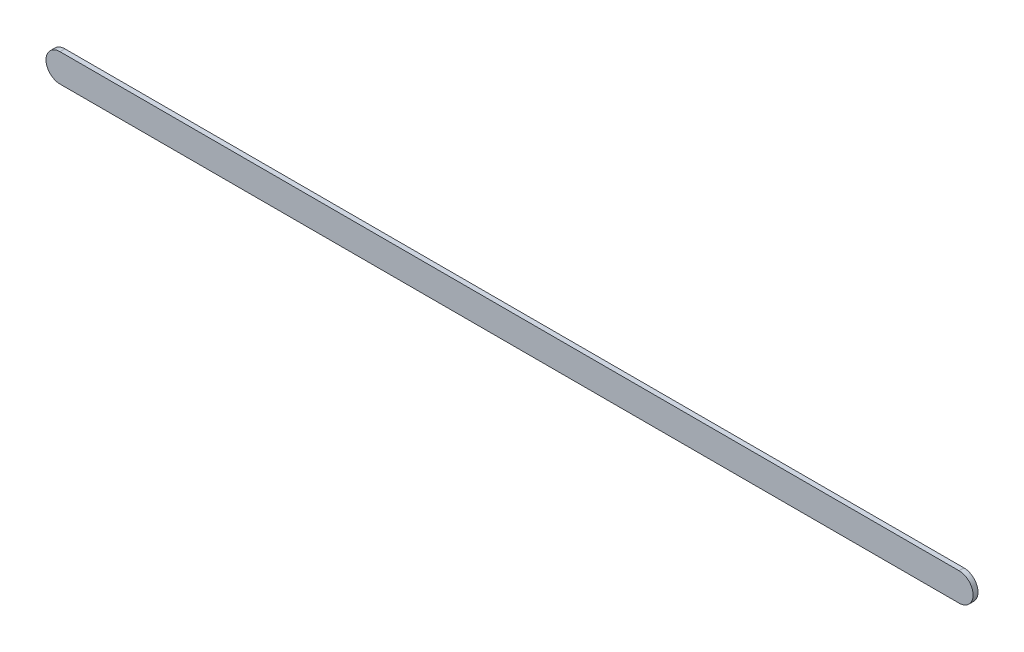
ISO-10303-21;
HEADER;
FILE_DESCRIPTION(('STEP AP214'),'2;1');
FILE_NAME('part.step','',(''),(''),'','','');
FILE_SCHEMA(('AUTOMOTIVE_DESIGN { 1 0 10303 214 1 1 1 1 }'));
ENDSEC;
DATA;
#1=APPLICATION_CONTEXT('core data for automotive mechanical design processes');
#2=APPLICATION_PROTOCOL_DEFINITION('international standard','automotive_design',2000,#1);
#3=PRODUCT_CONTEXT('',#1,'mechanical');
#4=PRODUCT('Part','Part','',(#3));
#5=PRODUCT_RELATED_PRODUCT_CATEGORY('part','',(#4));
#6=PRODUCT_DEFINITION_FORMATION('','',#4);
#7=PRODUCT_DEFINITION_CONTEXT('part definition',#1,'design');
#8=PRODUCT_DEFINITION('design','',#6,#7);
#9=PRODUCT_DEFINITION_SHAPE('','',#8);
#10=(LENGTH_UNIT() NAMED_UNIT(*) SI_UNIT(.MILLI.,.METRE.));
#11=(NAMED_UNIT(*) PLANE_ANGLE_UNIT() SI_UNIT($,.RADIAN.));
#12=(NAMED_UNIT(*) SI_UNIT($,.STERADIAN.) SOLID_ANGLE_UNIT());
#13=UNCERTAINTY_MEASURE_WITH_UNIT(LENGTH_MEASURE(1.E-05),#10,'distance_accuracy_value','');
#14=(GEOMETRIC_REPRESENTATION_CONTEXT(3) GLOBAL_UNCERTAINTY_ASSIGNED_CONTEXT((#13)) GLOBAL_UNIT_ASSIGNED_CONTEXT((#10,
#11,#12)) REPRESENTATION_CONTEXT('',''));
#15=CARTESIAN_POINT('',(0.,0.,0.));
#16=DIRECTION('',(0.,0.,1.));
#17=DIRECTION('',(1.,0.,0.));
#18=AXIS2_PLACEMENT_3D('',#15,#16,#17);
#19=CARTESIAN_POINT('',(101.55,-130.2,1.635));
#20=DIRECTION('',(0.,0.,1.));
#21=DIRECTION('',(1.,0.,0.));
#22=AXIS2_PLACEMENT_3D('',#19,#20,#21);
#23=PLANE('',#22);
#24=DIRECTION('',(-1.,0.,0.));
#25=VECTOR('',#24,1.);
#26=CARTESIAN_POINT('',(101.55,-130.2,1.635));
#27=LINE('',#26,#25);
#28=CARTESIAN_POINT('',(101.55,-130.2,1.635));
#29=VERTEX_POINT('',#28);
#30=CARTESIAN_POINT('',(95.146447,-130.2,1.635));
#31=VERTEX_POINT('',#30);
#32=EDGE_CURVE('E99',#29,#31,#27,.T.);
#33=ORIENTED_EDGE('',*,*,#32,.T.);
#34=CARTESIAN_POINT('',(95.146447,-130.3,1.635));
#35=DIRECTION('',(0.,0.,1.));
#36=DIRECTION('',(-2.84217094304E-13,1.,0.));
#37=AXIS2_PLACEMENT_3D('',#34,#35,#36);
#38=CIRCLE('',#37,0.1);
#39=CARTESIAN_POINT('',(95.146447,-130.4,1.635));
#40=VERTEX_POINT('',#39);
#41=EDGE_CURVE('E79',#31,#40,#38,.T.);
#42=ORIENTED_EDGE('',*,*,#41,.T.);
#43=DIRECTION('',(1.,0.,0.));
#44=VECTOR('',#43,1.);
#45=CARTESIAN_POINT('',(95.146447,-130.4,1.635));
#46=LINE('',#45,#44);
#47=CARTESIAN_POINT('',(101.55,-130.4,1.635));
#48=VERTEX_POINT('',#47);
#49=EDGE_CURVE('E20',#40,#48,#46,.T.);
#50=ORIENTED_EDGE('',*,*,#49,.T.);
#51=CARTESIAN_POINT('',(101.55,-130.3,1.635));
#52=DIRECTION('',(0.,0.,1.));
#53=DIRECTION('',(1.42108547152E-13,-1.,0.));
#54=AXIS2_PLACEMENT_3D('',#51,#52,#53);
#55=CIRCLE('',#54,0.1);
#56=EDGE_CURVE('E11',#48,#29,#55,.T.);
#57=ORIENTED_EDGE('',*,*,#56,.T.);
#58=EDGE_LOOP('',(#33,#42,#50,#57));
#59=FACE_BOUND('',#58,.T.);
#60=ADVANCED_FACE('F17',(#59),#23,.T.);
#61=CARTESIAN_POINT('',(101.55,-130.2,1.6));
#62=DIRECTION('',(0.,0.,1.));
#63=DIRECTION('',(1.,0.,0.));
#64=AXIS2_PLACEMENT_3D('',#61,#62,#63);
#65=PLANE('',#64);
#66=CARTESIAN_POINT('',(101.55,-130.3,1.6));
#67=DIRECTION('',(0.,0.,1.));
#68=DIRECTION('',(1.42108547152E-13,-1.,0.));
#69=AXIS2_PLACEMENT_3D('',#66,#67,#68);
#70=CIRCLE('',#69,0.1);
#71=CARTESIAN_POINT('',(101.55,-130.4,1.6));
#72=VERTEX_POINT('',#71);
#73=CARTESIAN_POINT('',(101.55,-130.2,1.6));
#74=VERTEX_POINT('',#73);
#75=EDGE_CURVE('E26',#72,#74,#70,.T.);
#76=ORIENTED_EDGE('',*,*,#75,.F.);
#77=DIRECTION('',(1.,0.,0.));
#78=VECTOR('',#77,1.);
#79=CARTESIAN_POINT('',(95.146447,-130.4,1.6));
#80=LINE('',#79,#78);
#81=CARTESIAN_POINT('',(95.146447,-130.4,1.6));
#82=VERTEX_POINT('',#81);
#83=EDGE_CURVE('E69',#82,#72,#80,.T.);
#84=ORIENTED_EDGE('',*,*,#83,.F.);
#85=CARTESIAN_POINT('',(95.146447,-130.3,1.6));
#86=DIRECTION('',(0.,0.,1.));
#87=DIRECTION('',(-2.84217094304E-13,1.,0.));
#88=AXIS2_PLACEMENT_3D('',#85,#86,#87);
#89=CIRCLE('',#88,0.1);
#90=CARTESIAN_POINT('',(95.146447,-130.2,1.6));
#91=VERTEX_POINT('',#90);
#92=EDGE_CURVE('E73',#91,#82,#89,.T.);
#93=ORIENTED_EDGE('',*,*,#92,.F.);
#94=DIRECTION('',(-1.,0.,0.));
#95=VECTOR('',#94,1.);
#96=CARTESIAN_POINT('',(101.55,-130.2,1.6));
#97=LINE('',#96,#95);
#98=EDGE_CURVE('E119',#74,#91,#97,.T.);
#99=ORIENTED_EDGE('',*,*,#98,.F.);
#100=EDGE_LOOP('',(#76,#84,#93,#99));
#101=FACE_BOUND('',#100,.T.);
#102=ADVANCED_FACE('F71',(#101),#65,.F.);
#103=CARTESIAN_POINT('',(101.55,-130.3,1.6));
#104=DIRECTION('',(0.,0.,-1.));
#105=DIRECTION('',(1.42108547152E-13,-1.,0.));
#106=AXIS2_PLACEMENT_3D('',#103,#104,#105);
#107=CYLINDRICAL_SURFACE('',#106,0.1);
#108=ORIENTED_EDGE('',*,*,#75,.T.);
#109=DIRECTION('',(0.,0.,1.));
#110=VECTOR('',#109,1.);
#111=CARTESIAN_POINT('',(101.55,-130.2,1.6));
#112=LINE('',#111,#110);
#113=EDGE_CURVE('E93',#74,#29,#112,.T.);
#114=ORIENTED_EDGE('',*,*,#113,.T.);
#115=ORIENTED_EDGE('',*,*,#56,.F.);
#116=DIRECTION('',(0.,0.,1.));
#117=VECTOR('',#116,1.);
#118=CARTESIAN_POINT('',(101.55,-130.4,1.6));
#119=LINE('',#118,#117);
#120=EDGE_CURVE('E78',#72,#48,#119,.T.);
#121=ORIENTED_EDGE('',*,*,#120,.F.);
#122=EDGE_LOOP('',(#108,#114,#115,#121));
#123=FACE_BOUND('',#122,.T.);
#124=ADVANCED_FACE('F115',(#123),#107,.T.);
#125=CARTESIAN_POINT('',(95.146447,-130.4,1.6));
#126=DIRECTION('',(0.,1.,0.));
#127=DIRECTION('',(1.,0.,0.));
#128=AXIS2_PLACEMENT_3D('',#125,#126,#127);
#129=PLANE('',#128);
#130=ORIENTED_EDGE('',*,*,#83,.T.);
#131=ORIENTED_EDGE('',*,*,#120,.T.);
#132=ORIENTED_EDGE('',*,*,#49,.F.);
#133=DIRECTION('',(0.,0.,1.));
#134=VECTOR('',#133,1.);
#135=CARTESIAN_POINT('',(95.146447,-130.4,1.6));
#136=LINE('',#135,#134);
#137=EDGE_CURVE('E82',#82,#40,#136,.T.);
#138=ORIENTED_EDGE('',*,*,#137,.F.);
#139=EDGE_LOOP('',(#130,#131,#132,#138));
#140=FACE_BOUND('',#139,.T.);
#141=ADVANCED_FACE('F83',(#140),#129,.F.);
#142=CARTESIAN_POINT('',(95.146447,-130.3,1.6));
#143=DIRECTION('',(0.,0.,-1.));
#144=DIRECTION('',(-2.84217094304E-13,1.,0.));
#145=AXIS2_PLACEMENT_3D('',#142,#143,#144);
#146=CYLINDRICAL_SURFACE('',#145,0.1);
#147=ORIENTED_EDGE('',*,*,#92,.T.);
#148=ORIENTED_EDGE('',*,*,#137,.T.);
#149=ORIENTED_EDGE('',*,*,#41,.F.);
#150=DIRECTION('',(0.,0.,1.));
#151=VECTOR('',#150,1.);
#152=CARTESIAN_POINT('',(95.146447,-130.2,1.6));
#153=LINE('',#152,#151);
#154=EDGE_CURVE('E90',#91,#31,#153,.T.);
#155=ORIENTED_EDGE('',*,*,#154,.F.);
#156=EDGE_LOOP('',(#147,#148,#149,#155));
#157=FACE_BOUND('',#156,.T.);
#158=ADVANCED_FACE('F88',(#157),#146,.T.);
#159=CARTESIAN_POINT('',(101.55,-130.2,1.6));
#160=DIRECTION('',(0.,-1.,0.));
#161=DIRECTION('',(0.,0.,-1.));
#162=AXIS2_PLACEMENT_3D('',#159,#160,#161);
#163=PLANE('',#162);
#164=ORIENTED_EDGE('',*,*,#98,.T.);
#165=ORIENTED_EDGE('',*,*,#154,.T.);
#166=ORIENTED_EDGE('',*,*,#32,.F.);
#167=ORIENTED_EDGE('',*,*,#113,.F.);
#168=EDGE_LOOP('',(#164,#165,#166,#167));
#169=FACE_BOUND('',#168,.T.);
#170=ADVANCED_FACE('F118',(#169),#163,.F.);
#171=CLOSED_SHELL('',(#60,#102,#124,#141,#158,#170));
#172=MANIFOLD_SOLID_BREP('B1',#171);
#173=ADVANCED_BREP_SHAPE_REPRESENTATION('',(#18,#172),#14);
#174=SHAPE_DEFINITION_REPRESENTATION(#9,#173);
ENDSEC;
END-ISO-10303-21;
